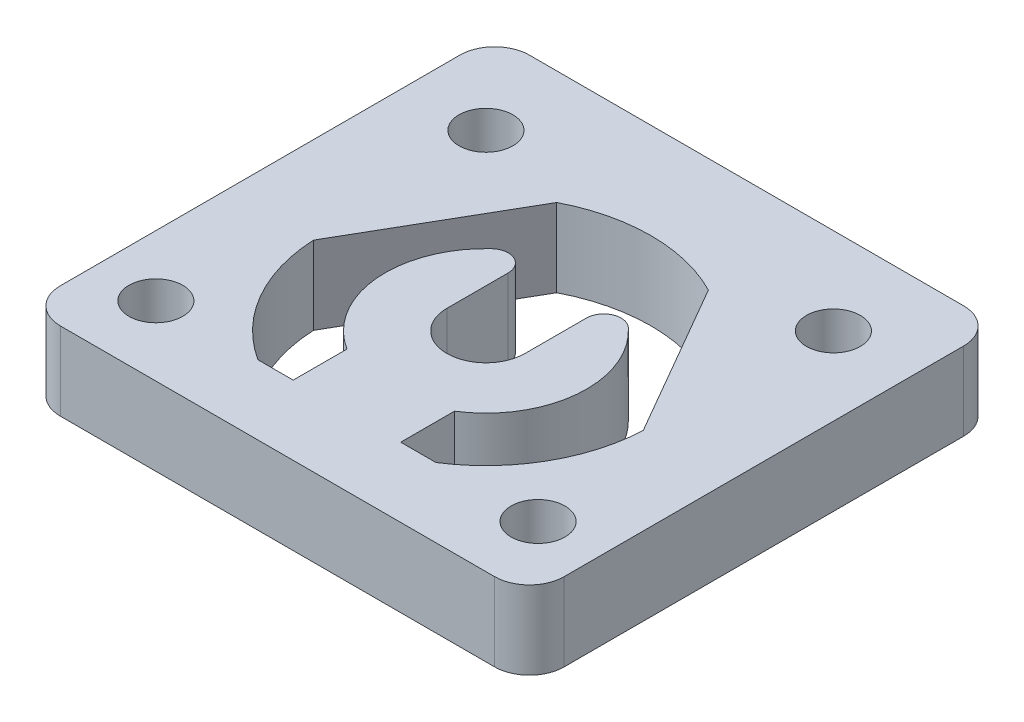
ISO-10303-21;
HEADER;
FILE_DESCRIPTION(('STEP AP214'),'2;1');
FILE_NAME('part.step','',(''),(''),'','','');
FILE_SCHEMA(('AUTOMOTIVE_DESIGN { 1 0 10303 214 1 1 1 1 }'));
ENDSEC;
DATA;
#1=APPLICATION_CONTEXT('core data for automotive mechanical design processes');
#2=APPLICATION_PROTOCOL_DEFINITION('international standard','automotive_design',2000,#1);
#3=PRODUCT_CONTEXT('',#1,'mechanical');
#4=PRODUCT('Part','Part','',(#3));
#5=PRODUCT_RELATED_PRODUCT_CATEGORY('part','',(#4));
#6=PRODUCT_DEFINITION_FORMATION('','',#4);
#7=PRODUCT_DEFINITION_CONTEXT('part definition',#1,'design');
#8=PRODUCT_DEFINITION('design','',#6,#7);
#9=PRODUCT_DEFINITION_SHAPE('','',#8);
#10=(LENGTH_UNIT() NAMED_UNIT(*) SI_UNIT(.MILLI.,.METRE.));
#11=(NAMED_UNIT(*) PLANE_ANGLE_UNIT() SI_UNIT($,.RADIAN.));
#12=(NAMED_UNIT(*) SI_UNIT($,.STERADIAN.) SOLID_ANGLE_UNIT());
#13=UNCERTAINTY_MEASURE_WITH_UNIT(LENGTH_MEASURE(1.E-05),#10,'distance_accuracy_value','');
#14=(GEOMETRIC_REPRESENTATION_CONTEXT(3) GLOBAL_UNCERTAINTY_ASSIGNED_CONTEXT((#13)) GLOBAL_UNIT_ASSIGNED_CONTEXT((#10,
#11,#12)) REPRESENTATION_CONTEXT('',''));
#15=CARTESIAN_POINT('',(0.,0.,0.));
#16=DIRECTION('',(0.,0.,1.));
#17=DIRECTION('',(1.,0.,0.));
#18=AXIS2_PLACEMENT_3D('',#15,#16,#17);
#19=CARTESIAN_POINT('',(12.5,4.5,-13.));
#20=DIRECTION('',(0.,-1.,0.));
#21=DIRECTION('',(0.,0.,-1.));
#22=AXIS2_PLACEMENT_3D('',#19,#20,#21);
#23=PLANE('',#22);
#24=CARTESIAN_POINT('',(12.5,4.5,-13.));
#25=DIRECTION('',(0.,1.,0.));
#26=DIRECTION('',(0.,0.,-1.));
#27=AXIS2_PLACEMENT_3D('',#24,#25,#26);
#28=CIRCLE('',#27,2.);
#29=CARTESIAN_POINT('',(14.5,4.5,-13.));
#30=VERTEX_POINT('',#29);
#31=CARTESIAN_POINT('',(12.5,4.5,-15.));
#32=VERTEX_POINT('',#31);
#33=EDGE_CURVE('E324',#30,#32,#28,.T.);
#34=ORIENTED_EDGE('',*,*,#33,.T.);
#35=DIRECTION('',(-1.,0.,0.));
#36=VECTOR('',#35,1.);
#37=CARTESIAN_POINT('',(-12.5,4.5,-15.));
#38=LINE('',#37,#36);
#39=CARTESIAN_POINT('',(-12.5,4.5,-15.));
#40=VERTEX_POINT('',#39);
#41=EDGE_CURVE('E327',#32,#40,#38,.T.);
#42=ORIENTED_EDGE('',*,*,#41,.T.);
#43=CARTESIAN_POINT('',(-12.5,4.5,-13.));
#44=DIRECTION('',(0.,1.,0.));
#45=DIRECTION('',(0.,0.,-1.));
#46=AXIS2_PLACEMENT_3D('',#43,#44,#45);
#47=CIRCLE('',#46,2.);
#48=CARTESIAN_POINT('',(-14.5,4.5,-13.));
#49=VERTEX_POINT('',#48);
#50=EDGE_CURVE('E330',#40,#49,#47,.T.);
#51=ORIENTED_EDGE('',*,*,#50,.T.);
#52=DIRECTION('',(0.,0.,1.));
#53=VECTOR('',#52,1.);
#54=CARTESIAN_POINT('',(-14.5,4.5,9.99999999999998));
#55=LINE('',#54,#53);
#56=CARTESIAN_POINT('',(-14.5,4.5,9.99999999999998));
#57=VERTEX_POINT('',#56);
#58=EDGE_CURVE('E332',#49,#57,#55,.T.);
#59=ORIENTED_EDGE('',*,*,#58,.T.);
#60=CARTESIAN_POINT('',(-12.5,4.5,9.99999999999999));
#61=DIRECTION('',(0.,1.,0.));
#62=DIRECTION('',(0.,0.,1.));
#63=AXIS2_PLACEMENT_3D('',#60,#61,#62);
#64=CIRCLE('',#63,2.);
#65=CARTESIAN_POINT('',(-12.5,4.5,12.));
#66=VERTEX_POINT('',#65);
#67=EDGE_CURVE('E334',#57,#66,#64,.T.);
#68=ORIENTED_EDGE('',*,*,#67,.T.);
#69=DIRECTION('',(1.,0.,0.));
#70=VECTOR('',#69,1.);
#71=CARTESIAN_POINT('',(-12.5,4.5,12.));
#72=LINE('',#71,#70);
#73=CARTESIAN_POINT('',(12.5,4.5,12.));
#74=VERTEX_POINT('',#73);
#75=EDGE_CURVE('E336',#66,#74,#72,.T.);
#76=ORIENTED_EDGE('',*,*,#75,.T.);
#77=CARTESIAN_POINT('',(12.5,4.5,10.));
#78=DIRECTION('',(0.,1.,0.));
#79=DIRECTION('',(0.,0.,1.));
#80=AXIS2_PLACEMENT_3D('',#77,#78,#79);
#81=CIRCLE('',#80,2.);
#82=CARTESIAN_POINT('',(14.5,4.5,9.99999999999998));
#83=VERTEX_POINT('',#82);
#84=EDGE_CURVE('E338',#74,#83,#81,.T.);
#85=ORIENTED_EDGE('',*,*,#84,.T.);
#86=DIRECTION('',(0.,0.,-1.));
#87=VECTOR('',#86,1.);
#88=CARTESIAN_POINT('',(14.5,4.5,9.99999999999998));
#89=LINE('',#88,#87);
#90=EDGE_CURVE('E340',#83,#30,#89,.T.);
#91=ORIENTED_EDGE('',*,*,#90,.T.);
#92=EDGE_LOOP('',(#34,#42,#51,#59,#68,#76,#85,#91));
#93=FACE_BOUND('',#92,.T.);
#94=CARTESIAN_POINT('',(0.,4.5,0.));
#95=DIRECTION('',(0.,-1.,0.));
#96=DIRECTION('',(0.,0.,1.));
#97=AXIS2_PLACEMENT_3D('',#94,#95,#96);
#98=CIRCLE('',#97,5.8);
#99=CARTESIAN_POINT('',(3.92708333333333,4.5,-4.26825684478518));
#100=VERTEX_POINT('',#99);
#101=CARTESIAN_POINT('',(3.09475362508875,4.5,4.90535421758715));
#102=VERTEX_POINT('',#101);
#103=EDGE_CURVE('E200',#100,#102,#98,.T.);
#104=ORIENTED_EDGE('',*,*,#103,.F.);
#105=CARTESIAN_POINT('',(3.25,4.5,-3.53235049223601));
#106=DIRECTION('',(0.,-1.,0.));
#107=DIRECTION('',(0.,0.,-1.));
#108=AXIS2_PLACEMENT_3D('',#105,#106,#107);
#109=CIRCLE('',#108,1.);
#110=CARTESIAN_POINT('',(2.25,4.5,-3.53235049223601));
#111=VERTEX_POINT('',#110);
#112=EDGE_CURVE('E251',#111,#100,#109,.T.);
#113=ORIENTED_EDGE('',*,*,#112,.F.);
#114=DIRECTION('',(0.,0.,-1.));
#115=VECTOR('',#114,1.);
#116=CARTESIAN_POINT('',(2.25,4.5,-3.53235049223601));
#117=LINE('',#116,#115);
#118=CARTESIAN_POINT('',(2.25,4.5,0.));
#119=VERTEX_POINT('',#118);
#120=EDGE_CURVE('E249',#119,#111,#117,.T.);
#121=ORIENTED_EDGE('',*,*,#120,.F.);
#122=CARTESIAN_POINT('',(0.,4.5,0.));
#123=DIRECTION('',(0.,1.,0.));
#124=DIRECTION('',(0.,0.,1.));
#125=AXIS2_PLACEMENT_3D('',#122,#123,#124);
#126=CIRCLE('',#125,2.25);
#127=CARTESIAN_POINT('',(-2.25,4.5,0.));
#128=VERTEX_POINT('',#127);
#129=EDGE_CURVE('E247',#128,#119,#126,.T.);
#130=ORIENTED_EDGE('',*,*,#129,.F.);
#131=DIRECTION('',(0.,0.,1.));
#132=VECTOR('',#131,1.);
#133=CARTESIAN_POINT('',(-2.25,4.5,-3.53235049223601));
#134=LINE('',#133,#132);
#135=CARTESIAN_POINT('',(-2.25,4.5,-3.53235049223601));
#136=VERTEX_POINT('',#135);
#137=EDGE_CURVE('E245',#136,#128,#134,.T.);
#138=ORIENTED_EDGE('',*,*,#137,.F.);
#139=CARTESIAN_POINT('',(-3.25,4.5,-3.53235049223601));
#140=DIRECTION('',(0.,-1.,0.));
#141=DIRECTION('',(0.,0.,1.));
#142=AXIS2_PLACEMENT_3D('',#139,#140,#141);
#143=CIRCLE('',#142,1.);
#144=CARTESIAN_POINT('',(-3.92708333333333,4.5,-4.26825684478518));
#145=VERTEX_POINT('',#144);
#146=EDGE_CURVE('E243',#145,#136,#143,.T.);
#147=ORIENTED_EDGE('',*,*,#146,.F.);
#148=CARTESIAN_POINT('',(0.,4.5,0.));
#149=DIRECTION('',(0.,-1.,0.));
#150=DIRECTION('',(0.,0.,1.));
#151=AXIS2_PLACEMENT_3D('',#148,#149,#150);
#152=CIRCLE('',#151,5.8);
#153=CARTESIAN_POINT('',(-3.09475362508875,4.5,4.90535421758715));
#154=VERTEX_POINT('',#153);
#155=EDGE_CURVE('E241',#154,#145,#152,.T.);
#156=ORIENTED_EDGE('',*,*,#155,.F.);
#157=DIRECTION('',(0.,0.,-1.));
#158=VECTOR('',#157,1.);
#159=CARTESIAN_POINT('',(-3.09475362508875,4.5,4.90535421758715));
#160=LINE('',#159,#158);
#161=CARTESIAN_POINT('',(-3.09475362508875,4.5,8.));
#162=VERTEX_POINT('',#161);
#163=EDGE_CURVE('E239',#162,#154,#160,.T.);
#164=ORIENTED_EDGE('',*,*,#163,.F.);
#165=DIRECTION('',(1.,0.,0.));
#166=VECTOR('',#165,1.);
#167=CARTESIAN_POINT('',(-5.1234753829798,4.5,8.));
#168=LINE('',#167,#166);
#169=CARTESIAN_POINT('',(-5.1234753829798,4.5,8.));
#170=VERTEX_POINT('',#169);
#171=EDGE_CURVE('E237',#170,#162,#168,.T.);
#172=ORIENTED_EDGE('',*,*,#171,.F.);
#173=CARTESIAN_POINT('',(0.,4.5,0.));
#174=DIRECTION('',(0.,1.,0.));
#175=DIRECTION('',(0.,0.,1.));
#176=AXIS2_PLACEMENT_3D('',#173,#174,#175);
#177=CIRCLE('',#176,9.5);
#178=CARTESIAN_POINT('',(-9.48994092176541,4.5,0.437059837324667));
#179=VERTEX_POINT('',#178);
#180=EDGE_CURVE('E235',#179,#170,#177,.T.);
#181=ORIENTED_EDGE('',*,*,#180,.F.);
#182=DIRECTION('',(-0.500000000000005,0.,0.866025403784436));
#183=VECTOR('',#182,1.);
#184=CARTESIAN_POINT('',(-4.36646553878556,4.5,-8.43705983732473));
#185=LINE('',#184,#183);
#186=CARTESIAN_POINT('',(-4.36646553878557,4.5,-8.43705983732473));
#187=VERTEX_POINT('',#186);
#188=EDGE_CURVE('E233',#187,#179,#185,.T.);
#189=ORIENTED_EDGE('',*,*,#188,.F.);
#190=CARTESIAN_POINT('',(0.,4.5,0.));
#191=DIRECTION('',(0.,1.,0.));
#192=DIRECTION('',(0.,0.,1.));
#193=AXIS2_PLACEMENT_3D('',#190,#191,#192);
#194=CIRCLE('',#193,9.5);
#195=CARTESIAN_POINT('',(4.36646553878556,4.5,-8.43705983732473));
#196=VERTEX_POINT('',#195);
#197=EDGE_CURVE('E231',#196,#187,#194,.T.);
#198=ORIENTED_EDGE('',*,*,#197,.F.);
#199=DIRECTION('',(-0.500000000000004,0.,-0.866025403784436));
#200=VECTOR('',#199,1.);
#201=CARTESIAN_POINT('',(4.36646553878556,4.5,-8.43705983732473));
#202=LINE('',#201,#200);
#203=CARTESIAN_POINT('',(9.48994092176541,4.5,0.437059837324668));
#204=VERTEX_POINT('',#203);
#205=EDGE_CURVE('E229',#204,#196,#202,.T.);
#206=ORIENTED_EDGE('',*,*,#205,.F.);
#207=CARTESIAN_POINT('',(0.,4.5,0.));
#208=DIRECTION('',(0.,1.,0.));
#209=DIRECTION('',(0.,0.,-1.));
#210=AXIS2_PLACEMENT_3D('',#207,#208,#209);
#211=CIRCLE('',#210,9.5);
#212=CARTESIAN_POINT('',(5.1234753829798,4.5,8.));
#213=VERTEX_POINT('',#212);
#214=EDGE_CURVE('E224',#213,#204,#211,.T.);
#215=ORIENTED_EDGE('',*,*,#214,.F.);
#216=DIRECTION('',(1.,0.,0.));
#217=VECTOR('',#216,1.);
#218=CARTESIAN_POINT('',(5.1234753829798,4.5,8.));
#219=LINE('',#218,#217);
#220=CARTESIAN_POINT('',(3.09475362508875,4.5,8.));
#221=VERTEX_POINT('',#220);
#222=EDGE_CURVE('E222',#221,#213,#219,.T.);
#223=ORIENTED_EDGE('',*,*,#222,.F.);
#224=DIRECTION('',(0.,0.,1.));
#225=VECTOR('',#224,1.);
#226=CARTESIAN_POINT('',(3.09475362508875,4.5,4.90535421758715));
#227=LINE('',#226,#225);
#228=EDGE_CURVE('E208',#102,#221,#227,.T.);
#229=ORIENTED_EDGE('',*,*,#228,.F.);
#230=EDGE_LOOP('',(#104,#113,#121,#130,#138,#147,#156,#164,#172,#181,#189,#198,#206,#215,#223,#229));
#231=FACE_BOUND('',#230,.T.);
#232=CARTESIAN_POINT('',(10.,4.5,-10.));
#233=DIRECTION('',(0.,1.,0.));
#234=DIRECTION('',(0.,0.,1.));
#235=AXIS2_PLACEMENT_3D('',#232,#233,#234);
#236=CIRCLE('',#235,1.55);
#237=CARTESIAN_POINT('',(10.,4.5,-8.45));
#238=VERTEX_POINT('',#237);
#239=EDGE_CURVE('E254',#238,#238,#236,.T.);
#240=ORIENTED_EDGE('',*,*,#239,.F.);
#241=EDGE_LOOP('',(#240));
#242=FACE_BOUND('',#241,.T.);
#243=CARTESIAN_POINT('',(11.,4.5,8.));
#244=DIRECTION('',(0.,1.,0.));
#245=DIRECTION('',(0.,0.,1.));
#246=AXIS2_PLACEMENT_3D('',#243,#244,#245);
#247=CIRCLE('',#246,1.55);
#248=CARTESIAN_POINT('',(11.,4.5,9.55));
#249=VERTEX_POINT('',#248);
#250=EDGE_CURVE('E534',#249,#249,#247,.T.);
#251=ORIENTED_EDGE('',*,*,#250,.F.);
#252=EDGE_LOOP('',(#251));
#253=FACE_BOUND('',#252,.T.);
#254=CARTESIAN_POINT('',(-11.,4.5,7.99999999999999));
#255=DIRECTION('',(0.,1.,0.));
#256=DIRECTION('',(0.,0.,-1.));
#257=AXIS2_PLACEMENT_3D('',#254,#255,#256);
#258=CIRCLE('',#257,1.55);
#259=CARTESIAN_POINT('',(-11.,4.5,6.44999999999999));
#260=VERTEX_POINT('',#259);
#261=EDGE_CURVE('E528',#260,#260,#258,.T.);
#262=ORIENTED_EDGE('',*,*,#261,.F.);
#263=EDGE_LOOP('',(#262));
#264=FACE_BOUND('',#263,.T.);
#265=CARTESIAN_POINT('',(-10.,4.5,-9.99999999999999));
#266=DIRECTION('',(0.,1.,0.));
#267=DIRECTION('',(0.,0.,-1.));
#268=AXIS2_PLACEMENT_3D('',#265,#266,#267);
#269=CIRCLE('',#268,1.55);
#270=CARTESIAN_POINT('',(-10.,4.5,-11.55));
#271=VERTEX_POINT('',#270);
#272=EDGE_CURVE('E519',#271,#271,#269,.T.);
#273=ORIENTED_EDGE('',*,*,#272,.F.);
#274=EDGE_LOOP('',(#273));
#275=FACE_BOUND('',#274,.T.);
#276=ADVANCED_FACE('F39',(#93,#231,#242,#253,#264,#275),#23,.F.);
#277=CARTESIAN_POINT('',(12.5,0.,-13.));
#278=DIRECTION('',(0.,-1.,0.));
#279=DIRECTION('',(0.,0.,-1.));
#280=AXIS2_PLACEMENT_3D('',#277,#278,#279);
#281=PLANE('',#280);
#282=CARTESIAN_POINT('',(-11.,0.,7.99999999999999));
#283=DIRECTION('',(0.,1.,0.));
#284=DIRECTION('',(0.,0.,-1.));
#285=AXIS2_PLACEMENT_3D('',#282,#283,#284);
#286=CIRCLE('',#285,1.55);
#287=CARTESIAN_POINT('',(-11.,0.,6.44999999999999));
#288=VERTEX_POINT('',#287);
#289=EDGE_CURVE('E525',#288,#288,#286,.T.);
#290=ORIENTED_EDGE('',*,*,#289,.T.);
#291=EDGE_LOOP('',(#290));
#292=FACE_BOUND('',#291,.T.);
#293=CARTESIAN_POINT('',(10.,0.,-10.));
#294=DIRECTION('',(0.,1.,0.));
#295=DIRECTION('',(0.,0.,1.));
#296=AXIS2_PLACEMENT_3D('',#293,#294,#295);
#297=CIRCLE('',#296,1.55);
#298=CARTESIAN_POINT('',(10.,0.,-8.45));
#299=VERTEX_POINT('',#298);
#300=EDGE_CURVE('E537',#299,#299,#297,.T.);
#301=ORIENTED_EDGE('',*,*,#300,.T.);
#302=EDGE_LOOP('',(#301));
#303=FACE_BOUND('',#302,.T.);
#304=CARTESIAN_POINT('',(12.5,0.,-13.));
#305=DIRECTION('',(0.,1.,0.));
#306=DIRECTION('',(0.,0.,-1.));
#307=AXIS2_PLACEMENT_3D('',#304,#305,#306);
#308=CIRCLE('',#307,2.);
#309=CARTESIAN_POINT('',(14.5,0.,-13.));
#310=VERTEX_POINT('',#309);
#311=CARTESIAN_POINT('',(12.5,0.,-15.));
#312=VERTEX_POINT('',#311);
#313=EDGE_CURVE('E216',#310,#312,#308,.T.);
#314=ORIENTED_EDGE('',*,*,#313,.F.);
#315=DIRECTION('',(0.,0.,-1.));
#316=VECTOR('',#315,1.);
#317=CARTESIAN_POINT('',(14.5,0.,9.99999999999998));
#318=LINE('',#317,#316);
#319=CARTESIAN_POINT('',(14.5,0.,9.99999999999998));
#320=VERTEX_POINT('',#319);
#321=EDGE_CURVE('E328',#320,#310,#318,.T.);
#322=ORIENTED_EDGE('',*,*,#321,.F.);
#323=CARTESIAN_POINT('',(12.5,0.,10.));
#324=DIRECTION('',(0.,1.,0.));
#325=DIRECTION('',(0.,0.,1.));
#326=AXIS2_PLACEMENT_3D('',#323,#324,#325);
#327=CIRCLE('',#326,2.);
#328=CARTESIAN_POINT('',(12.5,0.,12.));
#329=VERTEX_POINT('',#328);
#330=EDGE_CURVE('E355',#329,#320,#327,.T.);
#331=ORIENTED_EDGE('',*,*,#330,.F.);
#332=DIRECTION('',(1.,0.,0.));
#333=VECTOR('',#332,1.);
#334=CARTESIAN_POINT('',(-12.5,0.,12.));
#335=LINE('',#334,#333);
#336=CARTESIAN_POINT('',(-12.5,0.,12.));
#337=VERTEX_POINT('',#336);
#338=EDGE_CURVE('E353',#337,#329,#335,.T.);
#339=ORIENTED_EDGE('',*,*,#338,.F.);
#340=CARTESIAN_POINT('',(-12.5,0.,9.99999999999999));
#341=DIRECTION('',(0.,1.,0.));
#342=DIRECTION('',(0.,0.,1.));
#343=AXIS2_PLACEMENT_3D('',#340,#341,#342);
#344=CIRCLE('',#343,2.);
#345=CARTESIAN_POINT('',(-14.5,0.,9.99999999999998));
#346=VERTEX_POINT('',#345);
#347=EDGE_CURVE('E351',#346,#337,#344,.T.);
#348=ORIENTED_EDGE('',*,*,#347,.F.);
#349=DIRECTION('',(0.,0.,1.));
#350=VECTOR('',#349,1.);
#351=CARTESIAN_POINT('',(-14.5,0.,9.99999999999998));
#352=LINE('',#351,#350);
#353=CARTESIAN_POINT('',(-14.5,0.,-13.));
#354=VERTEX_POINT('',#353);
#355=EDGE_CURVE('E349',#354,#346,#352,.T.);
#356=ORIENTED_EDGE('',*,*,#355,.F.);
#357=CARTESIAN_POINT('',(-12.5,0.,-13.));
#358=DIRECTION('',(0.,1.,0.));
#359=DIRECTION('',(0.,0.,-1.));
#360=AXIS2_PLACEMENT_3D('',#357,#358,#359);
#361=CIRCLE('',#360,2.);
#362=CARTESIAN_POINT('',(-12.5,0.,-15.));
#363=VERTEX_POINT('',#362);
#364=EDGE_CURVE('E347',#363,#354,#361,.T.);
#365=ORIENTED_EDGE('',*,*,#364,.F.);
#366=DIRECTION('',(-1.,0.,0.));
#367=VECTOR('',#366,1.);
#368=CARTESIAN_POINT('',(-12.5,0.,-15.));
#369=LINE('',#368,#367);
#370=EDGE_CURVE('E345',#312,#363,#369,.T.);
#371=ORIENTED_EDGE('',*,*,#370,.F.);
#372=EDGE_LOOP('',(#314,#322,#331,#339,#348,#356,#365,#371));
#373=FACE_BOUND('',#372,.T.);
#374=CARTESIAN_POINT('',(3.25,0.,-3.53235049223601));
#375=DIRECTION('',(0.,-1.,0.));
#376=DIRECTION('',(0.,0.,-1.));
#377=AXIS2_PLACEMENT_3D('',#374,#375,#376);
#378=CIRCLE('',#377,1.);
#379=CARTESIAN_POINT('',(2.25,0.,-3.53235049223601));
#380=VERTEX_POINT('',#379);
#381=CARTESIAN_POINT('',(3.92708333333333,0.,-4.26825684478518));
#382=VERTEX_POINT('',#381);
#383=EDGE_CURVE('E209',#380,#382,#378,.T.);
#384=ORIENTED_EDGE('',*,*,#383,.T.);
#385=CARTESIAN_POINT('',(0.,0.,0.));
#386=DIRECTION('',(0.,-1.,0.));
#387=DIRECTION('',(0.,0.,1.));
#388=AXIS2_PLACEMENT_3D('',#385,#386,#387);
#389=CIRCLE('',#388,5.8);
#390=CARTESIAN_POINT('',(3.09475362508875,0.,4.90535421758715));
#391=VERTEX_POINT('',#390);
#392=EDGE_CURVE('E62',#382,#391,#389,.T.);
#393=ORIENTED_EDGE('',*,*,#392,.T.);
#394=DIRECTION('',(0.,0.,1.));
#395=VECTOR('',#394,1.);
#396=CARTESIAN_POINT('',(3.09475362508875,0.,4.90535421758715));
#397=LINE('',#396,#395);
#398=CARTESIAN_POINT('',(3.09475362508875,0.,8.));
#399=VERTEX_POINT('',#398);
#400=EDGE_CURVE('E215',#391,#399,#397,.T.);
#401=ORIENTED_EDGE('',*,*,#400,.T.);
#402=DIRECTION('',(1.,0.,0.));
#403=VECTOR('',#402,1.);
#404=CARTESIAN_POINT('',(5.1234753829798,0.,8.));
#405=LINE('',#404,#403);
#406=CARTESIAN_POINT('',(5.1234753829798,0.,8.));
#407=VERTEX_POINT('',#406);
#408=EDGE_CURVE('E256',#399,#407,#405,.T.);
#409=ORIENTED_EDGE('',*,*,#408,.T.);
#410=CARTESIAN_POINT('',(0.,0.,0.));
#411=DIRECTION('',(0.,1.,0.));
#412=DIRECTION('',(0.,0.,-1.));
#413=AXIS2_PLACEMENT_3D('',#410,#411,#412);
#414=CIRCLE('',#413,9.5);
#415=CARTESIAN_POINT('',(9.48994092176541,0.,0.437059837324668));
#416=VERTEX_POINT('',#415);
#417=EDGE_CURVE('E259',#407,#416,#414,.T.);
#418=ORIENTED_EDGE('',*,*,#417,.T.);
#419=DIRECTION('',(-0.500000000000004,0.,-0.866025403784436));
#420=VECTOR('',#419,1.);
#421=CARTESIAN_POINT('',(4.36646553878556,0.,-8.43705983732473));
#422=LINE('',#421,#420);
#423=CARTESIAN_POINT('',(4.36646553878556,0.,-8.43705983732473));
#424=VERTEX_POINT('',#423);
#425=EDGE_CURVE('E262',#416,#424,#422,.T.);
#426=ORIENTED_EDGE('',*,*,#425,.T.);
#427=CARTESIAN_POINT('',(0.,0.,0.));
#428=DIRECTION('',(0.,1.,0.));
#429=DIRECTION('',(0.,0.,1.));
#430=AXIS2_PLACEMENT_3D('',#427,#428,#429);
#431=CIRCLE('',#430,9.5);
#432=CARTESIAN_POINT('',(-4.36646553878557,0.,-8.43705983732473));
#433=VERTEX_POINT('',#432);
#434=EDGE_CURVE('E265',#424,#433,#431,.T.);
#435=ORIENTED_EDGE('',*,*,#434,.T.);
#436=DIRECTION('',(-0.500000000000005,0.,0.866025403784436));
#437=VECTOR('',#436,1.);
#438=CARTESIAN_POINT('',(-4.36646553878556,0.,-8.43705983732473));
#439=LINE('',#438,#437);
#440=CARTESIAN_POINT('',(-9.48994092176541,0.,0.437059837324667));
#441=VERTEX_POINT('',#440);
#442=EDGE_CURVE('E268',#433,#441,#439,.T.);
#443=ORIENTED_EDGE('',*,*,#442,.T.);
#444=CARTESIAN_POINT('',(0.,0.,0.));
#445=DIRECTION('',(0.,1.,0.));
#446=DIRECTION('',(0.,0.,1.));
#447=AXIS2_PLACEMENT_3D('',#444,#445,#446);
#448=CIRCLE('',#447,9.5);
#449=CARTESIAN_POINT('',(-5.1234753829798,0.,8.));
#450=VERTEX_POINT('',#449);
#451=EDGE_CURVE('E271',#441,#450,#448,.T.);
#452=ORIENTED_EDGE('',*,*,#451,.T.);
#453=DIRECTION('',(1.,0.,0.));
#454=VECTOR('',#453,1.);
#455=CARTESIAN_POINT('',(-5.1234753829798,0.,8.));
#456=LINE('',#455,#454);
#457=CARTESIAN_POINT('',(-3.09475362508875,0.,8.));
#458=VERTEX_POINT('',#457);
#459=EDGE_CURVE('E274',#450,#458,#456,.T.);
#460=ORIENTED_EDGE('',*,*,#459,.T.);
#461=DIRECTION('',(0.,0.,-1.));
#462=VECTOR('',#461,1.);
#463=CARTESIAN_POINT('',(-3.09475362508875,0.,4.90535421758715));
#464=LINE('',#463,#462);
#465=CARTESIAN_POINT('',(-3.09475362508875,0.,4.90535421758715));
#466=VERTEX_POINT('',#465);
#467=EDGE_CURVE('E277',#458,#466,#464,.T.);
#468=ORIENTED_EDGE('',*,*,#467,.T.);
#469=CARTESIAN_POINT('',(0.,0.,0.));
#470=DIRECTION('',(0.,-1.,0.));
#471=DIRECTION('',(0.,0.,1.));
#472=AXIS2_PLACEMENT_3D('',#469,#470,#471);
#473=CIRCLE('',#472,5.8);
#474=CARTESIAN_POINT('',(-3.92708333333333,0.,-4.26825684478518));
#475=VERTEX_POINT('',#474);
#476=EDGE_CURVE('E280',#466,#475,#473,.T.);
#477=ORIENTED_EDGE('',*,*,#476,.T.);
#478=CARTESIAN_POINT('',(-3.25,0.,-3.53235049223601));
#479=DIRECTION('',(0.,-1.,0.));
#480=DIRECTION('',(0.,0.,1.));
#481=AXIS2_PLACEMENT_3D('',#478,#479,#480);
#482=CIRCLE('',#481,1.);
#483=CARTESIAN_POINT('',(-2.25,0.,-3.53235049223601));
#484=VERTEX_POINT('',#483);
#485=EDGE_CURVE('E283',#475,#484,#482,.T.);
#486=ORIENTED_EDGE('',*,*,#485,.T.);
#487=DIRECTION('',(0.,0.,1.));
#488=VECTOR('',#487,1.);
#489=CARTESIAN_POINT('',(-2.25,0.,-3.53235049223601));
#490=LINE('',#489,#488);
#491=CARTESIAN_POINT('',(-2.25,0.,0.));
#492=VERTEX_POINT('',#491);
#493=EDGE_CURVE('E286',#484,#492,#490,.T.);
#494=ORIENTED_EDGE('',*,*,#493,.T.);
#495=CARTESIAN_POINT('',(0.,0.,0.));
#496=DIRECTION('',(0.,1.,0.));
#497=DIRECTION('',(0.,0.,1.));
#498=AXIS2_PLACEMENT_3D('',#495,#496,#497);
#499=CIRCLE('',#498,2.25);
#500=CARTESIAN_POINT('',(2.25,0.,0.));
#501=VERTEX_POINT('',#500);
#502=EDGE_CURVE('E289',#492,#501,#499,.T.);
#503=ORIENTED_EDGE('',*,*,#502,.T.);
#504=DIRECTION('',(0.,0.,-1.));
#505=VECTOR('',#504,1.);
#506=CARTESIAN_POINT('',(2.25,0.,-3.53235049223601));
#507=LINE('',#506,#505);
#508=EDGE_CURVE('E292',#501,#380,#507,.T.);
#509=ORIENTED_EDGE('',*,*,#508,.T.);
#510=EDGE_LOOP('',(#384,#393,#401,#409,#418,#426,#435,#443,#452,#460,#468,#477,#486,#494,#503,#509));
#511=FACE_BOUND('',#510,.T.);
#512=CARTESIAN_POINT('',(11.,0.,8.));
#513=DIRECTION('',(0.,1.,0.));
#514=DIRECTION('',(0.,0.,1.));
#515=AXIS2_PLACEMENT_3D('',#512,#513,#514);
#516=CIRCLE('',#515,1.55);
#517=CARTESIAN_POINT('',(11.,0.,9.55));
#518=VERTEX_POINT('',#517);
#519=EDGE_CURVE('E531',#518,#518,#516,.T.);
#520=ORIENTED_EDGE('',*,*,#519,.T.);
#521=EDGE_LOOP('',(#520));
#522=FACE_BOUND('',#521,.T.);
#523=CARTESIAN_POINT('',(-10.,0.,-9.99999999999999));
#524=DIRECTION('',(0.,1.,0.));
#525=DIRECTION('',(0.,0.,-1.));
#526=AXIS2_PLACEMENT_3D('',#523,#524,#525);
#527=CIRCLE('',#526,1.55);
#528=CARTESIAN_POINT('',(-10.,0.,-11.55));
#529=VERTEX_POINT('',#528);
#530=EDGE_CURVE('E522',#529,#529,#527,.T.);
#531=ORIENTED_EDGE('',*,*,#530,.T.);
#532=EDGE_LOOP('',(#531));
#533=FACE_BOUND('',#532,.T.);
#534=ADVANCED_FACE('F385',(#292,#303,#373,#511,#522,#533),#281,.T.);
#535=CARTESIAN_POINT('',(12.5,4.5,-13.));
#536=DIRECTION('',(0.,-1.,0.));
#537=DIRECTION('',(0.,0.,-1.));
#538=AXIS2_PLACEMENT_3D('',#535,#536,#537);
#539=CYLINDRICAL_SURFACE('',#538,2.);
#540=ORIENTED_EDGE('',*,*,#313,.T.);
#541=DIRECTION('',(0.,-1.,0.));
#542=VECTOR('',#541,1.);
#543=CARTESIAN_POINT('',(12.5,4.5,-15.));
#544=LINE('',#543,#542);
#545=EDGE_CURVE('E11',#32,#312,#544,.T.);
#546=ORIENTED_EDGE('',*,*,#545,.F.);
#547=ORIENTED_EDGE('',*,*,#33,.F.);
#548=DIRECTION('',(0.,-1.,0.));
#549=VECTOR('',#548,1.);
#550=CARTESIAN_POINT('',(14.5,4.5,-13.));
#551=LINE('',#550,#549);
#552=EDGE_CURVE('E342',#30,#310,#551,.T.);
#553=ORIENTED_EDGE('',*,*,#552,.T.);
#554=EDGE_LOOP('',(#540,#546,#547,#553));
#555=FACE_BOUND('',#554,.T.);
#556=ADVANCED_FACE('F41',(#555),#539,.T.);
#557=CARTESIAN_POINT('',(-12.5,4.5,-15.));
#558=DIRECTION('',(0.,0.,1.));
#559=DIRECTION('',(1.,0.,0.));
#560=AXIS2_PLACEMENT_3D('',#557,#558,#559);
#561=PLANE('',#560);
#562=ORIENTED_EDGE('',*,*,#370,.T.);
#563=DIRECTION('',(0.,-1.,0.));
#564=VECTOR('',#563,1.);
#565=CARTESIAN_POINT('',(-12.5,4.5,-15.));
#566=LINE('',#565,#564);
#567=EDGE_CURVE('E47',#40,#363,#566,.T.);
#568=ORIENTED_EDGE('',*,*,#567,.F.);
#569=ORIENTED_EDGE('',*,*,#41,.F.);
#570=ORIENTED_EDGE('',*,*,#545,.T.);
#571=EDGE_LOOP('',(#562,#568,#569,#570));
#572=FACE_BOUND('',#571,.T.);
#573=ADVANCED_FACE('F402',(#572),#561,.F.);
#574=CARTESIAN_POINT('',(-12.5,4.5,-13.));
#575=DIRECTION('',(0.,-1.,0.));
#576=DIRECTION('',(0.,0.,-1.));
#577=AXIS2_PLACEMENT_3D('',#574,#575,#576);
#578=CYLINDRICAL_SURFACE('',#577,2.);
#579=ORIENTED_EDGE('',*,*,#364,.T.);
#580=DIRECTION('',(0.,-1.,0.));
#581=VECTOR('',#580,1.);
#582=CARTESIAN_POINT('',(-14.5,4.5,-13.));
#583=LINE('',#582,#581);
#584=EDGE_CURVE('E372',#49,#354,#583,.T.);
#585=ORIENTED_EDGE('',*,*,#584,.F.);
#586=ORIENTED_EDGE('',*,*,#50,.F.);
#587=ORIENTED_EDGE('',*,*,#567,.T.);
#588=EDGE_LOOP('',(#579,#585,#586,#587));
#589=FACE_BOUND('',#588,.T.);
#590=ADVANCED_FACE('F379',(#589),#578,.T.);
#591=CARTESIAN_POINT('',(-14.5,4.5,9.99999999999998));
#592=DIRECTION('',(1.,0.,0.));
#593=DIRECTION('',(0.,0.,-1.));
#594=AXIS2_PLACEMENT_3D('',#591,#592,#593);
#595=PLANE('',#594);
#596=ORIENTED_EDGE('',*,*,#355,.T.);
#597=DIRECTION('',(0.,-1.,0.));
#598=VECTOR('',#597,1.);
#599=CARTESIAN_POINT('',(-14.5,4.5,9.99999999999998));
#600=LINE('',#599,#598);
#601=EDGE_CURVE('E369',#57,#346,#600,.T.);
#602=ORIENTED_EDGE('',*,*,#601,.F.);
#603=ORIENTED_EDGE('',*,*,#58,.F.);
#604=ORIENTED_EDGE('',*,*,#584,.T.);
#605=EDGE_LOOP('',(#596,#602,#603,#604));
#606=FACE_BOUND('',#605,.T.);
#607=ADVANCED_FACE('F391',(#606),#595,.F.);
#608=CARTESIAN_POINT('',(-12.5,4.5,9.99999999999999));
#609=DIRECTION('',(0.,-1.,0.));
#610=DIRECTION('',(0.,0.,-1.));
#611=AXIS2_PLACEMENT_3D('',#608,#609,#610);
#612=CYLINDRICAL_SURFACE('',#611,2.);
#613=ORIENTED_EDGE('',*,*,#347,.T.);
#614=DIRECTION('',(0.,-1.,0.));
#615=VECTOR('',#614,1.);
#616=CARTESIAN_POINT('',(-12.5,4.5,12.));
#617=LINE('',#616,#615);
#618=EDGE_CURVE('E366',#66,#337,#617,.T.);
#619=ORIENTED_EDGE('',*,*,#618,.F.);
#620=ORIENTED_EDGE('',*,*,#67,.F.);
#621=ORIENTED_EDGE('',*,*,#601,.T.);
#622=EDGE_LOOP('',(#613,#619,#620,#621));
#623=FACE_BOUND('',#622,.T.);
#624=ADVANCED_FACE('F395',(#623),#612,.T.);
#625=CARTESIAN_POINT('',(-12.5,4.5,12.));
#626=DIRECTION('',(0.,0.,-1.));
#627=DIRECTION('',(-1.,0.,0.));
#628=AXIS2_PLACEMENT_3D('',#625,#626,#627);
#629=PLANE('',#628);
#630=ORIENTED_EDGE('',*,*,#338,.T.);
#631=DIRECTION('',(0.,-1.,0.));
#632=VECTOR('',#631,1.);
#633=CARTESIAN_POINT('',(12.5,4.5,12.));
#634=LINE('',#633,#632);
#635=EDGE_CURVE('E363',#74,#329,#634,.T.);
#636=ORIENTED_EDGE('',*,*,#635,.F.);
#637=ORIENTED_EDGE('',*,*,#75,.F.);
#638=ORIENTED_EDGE('',*,*,#618,.T.);
#639=EDGE_LOOP('',(#630,#636,#637,#638));
#640=FACE_BOUND('',#639,.T.);
#641=ADVANCED_FACE('F415',(#640),#629,.F.);
#642=CARTESIAN_POINT('',(12.5,4.5,10.));
#643=DIRECTION('',(0.,-1.,0.));
#644=DIRECTION('',(0.,0.,-1.));
#645=AXIS2_PLACEMENT_3D('',#642,#643,#644);
#646=CYLINDRICAL_SURFACE('',#645,2.);
#647=ORIENTED_EDGE('',*,*,#330,.T.);
#648=DIRECTION('',(0.,-1.,0.));
#649=VECTOR('',#648,1.);
#650=CARTESIAN_POINT('',(14.5,4.5,9.99999999999998));
#651=LINE('',#650,#649);
#652=EDGE_CURVE('E360',#83,#320,#651,.T.);
#653=ORIENTED_EDGE('',*,*,#652,.F.);
#654=ORIENTED_EDGE('',*,*,#84,.F.);
#655=ORIENTED_EDGE('',*,*,#635,.T.);
#656=EDGE_LOOP('',(#647,#653,#654,#655));
#657=FACE_BOUND('',#656,.T.);
#658=ADVANCED_FACE('F413',(#657),#646,.T.);
#659=CARTESIAN_POINT('',(14.5,4.5,9.99999999999998));
#660=DIRECTION('',(-1.,0.,0.));
#661=DIRECTION('',(0.,0.,1.));
#662=AXIS2_PLACEMENT_3D('',#659,#660,#661);
#663=PLANE('',#662);
#664=ORIENTED_EDGE('',*,*,#321,.T.);
#665=ORIENTED_EDGE('',*,*,#552,.F.);
#666=ORIENTED_EDGE('',*,*,#90,.F.);
#667=ORIENTED_EDGE('',*,*,#652,.T.);
#668=EDGE_LOOP('',(#664,#665,#666,#667));
#669=FACE_BOUND('',#668,.T.);
#670=ADVANCED_FACE('F408',(#669),#663,.F.);
#671=CARTESIAN_POINT('',(0.,4.5,0.));
#672=DIRECTION('',(0.,-1.,0.));
#673=DIRECTION('',(0.,0.,-1.));
#674=AXIS2_PLACEMENT_3D('',#671,#672,#673);
#675=CYLINDRICAL_SURFACE('',#674,5.8);
#676=ORIENTED_EDGE('',*,*,#392,.F.);
#677=DIRECTION('',(0.,-1.,0.));
#678=VECTOR('',#677,1.);
#679=CARTESIAN_POINT('',(3.92708333333333,4.5,-4.26825684478518));
#680=LINE('',#679,#678);
#681=EDGE_CURVE('E204',#100,#382,#680,.T.);
#682=ORIENTED_EDGE('',*,*,#681,.F.);
#683=ORIENTED_EDGE('',*,*,#103,.T.);
#684=DIRECTION('',(0.,-1.,0.));
#685=VECTOR('',#684,1.);
#686=CARTESIAN_POINT('',(3.09475362508875,4.5,4.90535421758715));
#687=LINE('',#686,#685);
#688=EDGE_CURVE('E203',#102,#391,#687,.T.);
#689=ORIENTED_EDGE('',*,*,#688,.T.);
#690=EDGE_LOOP('',(#676,#682,#683,#689));
#691=FACE_BOUND('',#690,.T.);
#692=ADVANCED_FACE('F202',(#691),#675,.T.);
#693=CARTESIAN_POINT('',(3.09475362508875,4.5,4.90535421758715));
#694=DIRECTION('',(1.,0.,0.));
#695=DIRECTION('',(0.,0.,-1.));
#696=AXIS2_PLACEMENT_3D('',#693,#694,#695);
#697=PLANE('',#696);
#698=ORIENTED_EDGE('',*,*,#400,.F.);
#699=ORIENTED_EDGE('',*,*,#688,.F.);
#700=ORIENTED_EDGE('',*,*,#228,.T.);
#701=DIRECTION('',(0.,-1.,0.));
#702=VECTOR('',#701,1.);
#703=CARTESIAN_POINT('',(3.09475362508875,4.5,8.));
#704=LINE('',#703,#702);
#705=EDGE_CURVE('E217',#221,#399,#704,.T.);
#706=ORIENTED_EDGE('',*,*,#705,.T.);
#707=EDGE_LOOP('',(#698,#699,#700,#706));
#708=FACE_BOUND('',#707,.T.);
#709=ADVANCED_FACE('F212',(#708),#697,.T.);
#710=CARTESIAN_POINT('',(5.1234753829798,4.5,8.));
#711=DIRECTION('',(0.,0.,-1.));
#712=DIRECTION('',(-1.,0.,0.));
#713=AXIS2_PLACEMENT_3D('',#710,#711,#712);
#714=PLANE('',#713);
#715=ORIENTED_EDGE('',*,*,#408,.F.);
#716=ORIENTED_EDGE('',*,*,#705,.F.);
#717=ORIENTED_EDGE('',*,*,#222,.T.);
#718=DIRECTION('',(0.,-1.,0.));
#719=VECTOR('',#718,1.);
#720=CARTESIAN_POINT('',(5.1234753829798,4.5,8.));
#721=LINE('',#720,#719);
#722=EDGE_CURVE('E321',#213,#407,#721,.T.);
#723=ORIENTED_EDGE('',*,*,#722,.T.);
#724=EDGE_LOOP('',(#715,#716,#717,#723));
#725=FACE_BOUND('',#724,.T.);
#726=ADVANCED_FACE('F441',(#725),#714,.T.);
#727=CARTESIAN_POINT('',(0.,4.5,0.));
#728=DIRECTION('',(0.,-1.,0.));
#729=DIRECTION('',(0.,0.,-1.));
#730=AXIS2_PLACEMENT_3D('',#727,#728,#729);
#731=CYLINDRICAL_SURFACE('',#730,9.5);
#732=ORIENTED_EDGE('',*,*,#417,.F.);
#733=ORIENTED_EDGE('',*,*,#722,.F.);
#734=ORIENTED_EDGE('',*,*,#214,.T.);
#735=DIRECTION('',(0.,-1.,0.));
#736=VECTOR('',#735,1.);
#737=CARTESIAN_POINT('',(9.48994092176541,4.5,0.437059837324668));
#738=LINE('',#737,#736);
#739=EDGE_CURVE('E319',#204,#416,#738,.T.);
#740=ORIENTED_EDGE('',*,*,#739,.T.);
#741=EDGE_LOOP('',(#732,#733,#734,#740));
#742=FACE_BOUND('',#741,.T.);
#743=ADVANCED_FACE('F445',(#742),#731,.F.);
#744=CARTESIAN_POINT('',(4.36646553878556,4.5,-8.43705983732473));
#745=DIRECTION('',(-0.866025403784436,0.,0.500000000000004));
#746=DIRECTION('',(0.500000000000005,0.,0.866025403784436));
#747=AXIS2_PLACEMENT_3D('',#744,#745,#746);
#748=PLANE('',#747);
#749=ORIENTED_EDGE('',*,*,#425,.F.);
#750=ORIENTED_EDGE('',*,*,#739,.F.);
#751=ORIENTED_EDGE('',*,*,#205,.T.);
#752=DIRECTION('',(0.,-1.,0.));
#753=VECTOR('',#752,1.);
#754=CARTESIAN_POINT('',(4.36646553878556,4.5,-8.43705983732473));
#755=LINE('',#754,#753);
#756=EDGE_CURVE('E317',#196,#424,#755,.T.);
#757=ORIENTED_EDGE('',*,*,#756,.T.);
#758=EDGE_LOOP('',(#749,#750,#751,#757));
#759=FACE_BOUND('',#758,.T.);
#760=ADVANCED_FACE('F451',(#759),#748,.T.);
#761=CARTESIAN_POINT('',(0.,4.5,0.));
#762=DIRECTION('',(0.,-1.,0.));
#763=DIRECTION('',(0.,0.,-1.));
#764=AXIS2_PLACEMENT_3D('',#761,#762,#763);
#765=CYLINDRICAL_SURFACE('',#764,9.5);
#766=ORIENTED_EDGE('',*,*,#434,.F.);
#767=ORIENTED_EDGE('',*,*,#756,.F.);
#768=ORIENTED_EDGE('',*,*,#197,.T.);
#769=DIRECTION('',(0.,-1.,0.));
#770=VECTOR('',#769,1.);
#771=CARTESIAN_POINT('',(-4.36646553878557,4.5,-8.43705983732473));
#772=LINE('',#771,#770);
#773=EDGE_CURVE('E315',#187,#433,#772,.T.);
#774=ORIENTED_EDGE('',*,*,#773,.T.);
#775=EDGE_LOOP('',(#766,#767,#768,#774));
#776=FACE_BOUND('',#775,.T.);
#777=ADVANCED_FACE('F455',(#776),#765,.F.);
#778=CARTESIAN_POINT('',(-4.36646553878556,4.5,-8.43705983732473));
#779=DIRECTION('',(0.866025403784436,0.,0.500000000000005));
#780=DIRECTION('',(0.500000000000005,0.,-0.866025403784436));
#781=AXIS2_PLACEMENT_3D('',#778,#779,#780);
#782=PLANE('',#781);
#783=ORIENTED_EDGE('',*,*,#442,.F.);
#784=ORIENTED_EDGE('',*,*,#773,.F.);
#785=ORIENTED_EDGE('',*,*,#188,.T.);
#786=DIRECTION('',(0.,-1.,0.));
#787=VECTOR('',#786,1.);
#788=CARTESIAN_POINT('',(-9.48994092176541,4.5,0.437059837324667));
#789=LINE('',#788,#787);
#790=EDGE_CURVE('E313',#179,#441,#789,.T.);
#791=ORIENTED_EDGE('',*,*,#790,.T.);
#792=EDGE_LOOP('',(#783,#784,#785,#791));
#793=FACE_BOUND('',#792,.T.);
#794=ADVANCED_FACE('F459',(#793),#782,.T.);
#795=CARTESIAN_POINT('',(0.,4.5,0.));
#796=DIRECTION('',(0.,-1.,0.));
#797=DIRECTION('',(0.,0.,-1.));
#798=AXIS2_PLACEMENT_3D('',#795,#796,#797);
#799=CYLINDRICAL_SURFACE('',#798,9.5);
#800=ORIENTED_EDGE('',*,*,#451,.F.);
#801=ORIENTED_EDGE('',*,*,#790,.F.);
#802=ORIENTED_EDGE('',*,*,#180,.T.);
#803=DIRECTION('',(0.,-1.,0.));
#804=VECTOR('',#803,1.);
#805=CARTESIAN_POINT('',(-5.1234753829798,4.5,8.));
#806=LINE('',#805,#804);
#807=EDGE_CURVE('E311',#170,#450,#806,.T.);
#808=ORIENTED_EDGE('',*,*,#807,.T.);
#809=EDGE_LOOP('',(#800,#801,#802,#808));
#810=FACE_BOUND('',#809,.T.);
#811=ADVANCED_FACE('F463',(#810),#799,.F.);
#812=CARTESIAN_POINT('',(-5.1234753829798,4.5,8.));
#813=DIRECTION('',(0.,0.,-1.));
#814=DIRECTION('',(-1.,0.,0.));
#815=AXIS2_PLACEMENT_3D('',#812,#813,#814);
#816=PLANE('',#815);
#817=ORIENTED_EDGE('',*,*,#459,.F.);
#818=ORIENTED_EDGE('',*,*,#807,.F.);
#819=ORIENTED_EDGE('',*,*,#171,.T.);
#820=DIRECTION('',(0.,-1.,0.));
#821=VECTOR('',#820,1.);
#822=CARTESIAN_POINT('',(-3.09475362508875,4.5,8.));
#823=LINE('',#822,#821);
#824=EDGE_CURVE('E309',#162,#458,#823,.T.);
#825=ORIENTED_EDGE('',*,*,#824,.T.);
#826=EDGE_LOOP('',(#817,#818,#819,#825));
#827=FACE_BOUND('',#826,.T.);
#828=ADVANCED_FACE('F467',(#827),#816,.T.);
#829=CARTESIAN_POINT('',(-3.09475362508875,4.5,4.90535421758715));
#830=DIRECTION('',(-1.,0.,0.));
#831=DIRECTION('',(0.,0.,1.));
#832=AXIS2_PLACEMENT_3D('',#829,#830,#831);
#833=PLANE('',#832);
#834=ORIENTED_EDGE('',*,*,#467,.F.);
#835=ORIENTED_EDGE('',*,*,#824,.F.);
#836=ORIENTED_EDGE('',*,*,#163,.T.);
#837=DIRECTION('',(0.,-1.,0.));
#838=VECTOR('',#837,1.);
#839=CARTESIAN_POINT('',(-3.09475362508875,4.5,4.90535421758715));
#840=LINE('',#839,#838);
#841=EDGE_CURVE('E307',#154,#466,#840,.T.);
#842=ORIENTED_EDGE('',*,*,#841,.T.);
#843=EDGE_LOOP('',(#834,#835,#836,#842));
#844=FACE_BOUND('',#843,.T.);
#845=ADVANCED_FACE('F471',(#844),#833,.T.);
#846=CARTESIAN_POINT('',(0.,4.5,0.));
#847=DIRECTION('',(0.,-1.,0.));
#848=DIRECTION('',(0.,0.,-1.));
#849=AXIS2_PLACEMENT_3D('',#846,#847,#848);
#850=CYLINDRICAL_SURFACE('',#849,5.8);
#851=ORIENTED_EDGE('',*,*,#476,.F.);
#852=ORIENTED_EDGE('',*,*,#841,.F.);
#853=ORIENTED_EDGE('',*,*,#155,.T.);
#854=DIRECTION('',(0.,-1.,0.));
#855=VECTOR('',#854,1.);
#856=CARTESIAN_POINT('',(-3.92708333333333,4.5,-4.26825684478518));
#857=LINE('',#856,#855);
#858=EDGE_CURVE('E305',#145,#475,#857,.T.);
#859=ORIENTED_EDGE('',*,*,#858,.T.);
#860=EDGE_LOOP('',(#851,#852,#853,#859));
#861=FACE_BOUND('',#860,.T.);
#862=ADVANCED_FACE('F475',(#861),#850,.T.);
#863=CARTESIAN_POINT('',(-3.25,4.5,-3.53235049223601));
#864=DIRECTION('',(0.,-1.,0.));
#865=DIRECTION('',(0.,0.,-1.));
#866=AXIS2_PLACEMENT_3D('',#863,#864,#865);
#867=CYLINDRICAL_SURFACE('',#866,1.);
#868=ORIENTED_EDGE('',*,*,#485,.F.);
#869=ORIENTED_EDGE('',*,*,#858,.F.);
#870=ORIENTED_EDGE('',*,*,#146,.T.);
#871=DIRECTION('',(0.,-1.,0.));
#872=VECTOR('',#871,1.);
#873=CARTESIAN_POINT('',(-2.25,4.5,-3.53235049223601));
#874=LINE('',#873,#872);
#875=EDGE_CURVE('E303',#136,#484,#874,.T.);
#876=ORIENTED_EDGE('',*,*,#875,.T.);
#877=EDGE_LOOP('',(#868,#869,#870,#876));
#878=FACE_BOUND('',#877,.T.);
#879=ADVANCED_FACE('F479',(#878),#867,.T.);
#880=CARTESIAN_POINT('',(-2.25,4.5,-3.53235049223601));
#881=DIRECTION('',(1.,0.,0.));
#882=DIRECTION('',(0.,0.,-1.));
#883=AXIS2_PLACEMENT_3D('',#880,#881,#882);
#884=PLANE('',#883);
#885=ORIENTED_EDGE('',*,*,#493,.F.);
#886=ORIENTED_EDGE('',*,*,#875,.F.);
#887=ORIENTED_EDGE('',*,*,#137,.T.);
#888=DIRECTION('',(0.,-1.,0.));
#889=VECTOR('',#888,1.);
#890=CARTESIAN_POINT('',(-2.25,4.5,0.));
#891=LINE('',#890,#889);
#892=EDGE_CURVE('E301',#128,#492,#891,.T.);
#893=ORIENTED_EDGE('',*,*,#892,.T.);
#894=EDGE_LOOP('',(#885,#886,#887,#893));
#895=FACE_BOUND('',#894,.T.);
#896=ADVANCED_FACE('F483',(#895),#884,.T.);
#897=CARTESIAN_POINT('',(0.,4.5,0.));
#898=DIRECTION('',(0.,-1.,0.));
#899=DIRECTION('',(0.,0.,-1.));
#900=AXIS2_PLACEMENT_3D('',#897,#898,#899);
#901=CYLINDRICAL_SURFACE('',#900,2.25);
#902=ORIENTED_EDGE('',*,*,#502,.F.);
#903=ORIENTED_EDGE('',*,*,#892,.F.);
#904=ORIENTED_EDGE('',*,*,#129,.T.);
#905=DIRECTION('',(0.,-1.,0.));
#906=VECTOR('',#905,1.);
#907=CARTESIAN_POINT('',(2.25,4.5,0.));
#908=LINE('',#907,#906);
#909=EDGE_CURVE('E299',#119,#501,#908,.T.);
#910=ORIENTED_EDGE('',*,*,#909,.T.);
#911=EDGE_LOOP('',(#902,#903,#904,#910));
#912=FACE_BOUND('',#911,.T.);
#913=ADVANCED_FACE('F487',(#912),#901,.F.);
#914=CARTESIAN_POINT('',(2.25,4.5,-3.53235049223601));
#915=DIRECTION('',(-1.,0.,0.));
#916=DIRECTION('',(0.,0.,1.));
#917=AXIS2_PLACEMENT_3D('',#914,#915,#916);
#918=PLANE('',#917);
#919=ORIENTED_EDGE('',*,*,#508,.F.);
#920=ORIENTED_EDGE('',*,*,#909,.F.);
#921=ORIENTED_EDGE('',*,*,#120,.T.);
#922=DIRECTION('',(0.,-1.,0.));
#923=VECTOR('',#922,1.);
#924=CARTESIAN_POINT('',(2.25,4.5,-3.53235049223601));
#925=LINE('',#924,#923);
#926=EDGE_CURVE('E54',#111,#380,#925,.T.);
#927=ORIENTED_EDGE('',*,*,#926,.T.);
#928=EDGE_LOOP('',(#919,#920,#921,#927));
#929=FACE_BOUND('',#928,.T.);
#930=ADVANCED_FACE('F491',(#929),#918,.T.);
#931=CARTESIAN_POINT('',(3.25,4.5,-3.53235049223601));
#932=DIRECTION('',(0.,-1.,0.));
#933=DIRECTION('',(0.,0.,-1.));
#934=AXIS2_PLACEMENT_3D('',#931,#932,#933);
#935=CYLINDRICAL_SURFACE('',#934,1.);
#936=ORIENTED_EDGE('',*,*,#383,.F.);
#937=ORIENTED_EDGE('',*,*,#926,.F.);
#938=ORIENTED_EDGE('',*,*,#112,.T.);
#939=ORIENTED_EDGE('',*,*,#681,.T.);
#940=EDGE_LOOP('',(#936,#937,#938,#939));
#941=FACE_BOUND('',#940,.T.);
#942=ADVANCED_FACE('F495',(#941),#935,.T.);
#943=CARTESIAN_POINT('',(10.,4.5,-10.));
#944=DIRECTION('',(0.,-1.,0.));
#945=DIRECTION('',(0.,0.,-1.));
#946=AXIS2_PLACEMENT_3D('',#943,#944,#945);
#947=CYLINDRICAL_SURFACE('',#946,1.55);
#948=ORIENTED_EDGE('',*,*,#239,.T.);
#949=EDGE_LOOP('',(#948));
#950=FACE_BOUND('',#949,.T.);
#951=ORIENTED_EDGE('',*,*,#300,.F.);
#952=EDGE_LOOP('',(#951));
#953=FACE_BOUND('',#952,.T.);
#954=ADVANCED_FACE('F499',(#950,#953),#947,.F.);
#955=CARTESIAN_POINT('',(11.,4.5,8.));
#956=DIRECTION('',(0.,-1.,0.));
#957=DIRECTION('',(0.,0.,-1.));
#958=AXIS2_PLACEMENT_3D('',#955,#956,#957);
#959=CYLINDRICAL_SURFACE('',#958,1.55);
#960=ORIENTED_EDGE('',*,*,#250,.T.);
#961=EDGE_LOOP('',(#960));
#962=FACE_BOUND('',#961,.T.);
#963=ORIENTED_EDGE('',*,*,#519,.F.);
#964=EDGE_LOOP('',(#963));
#965=FACE_BOUND('',#964,.T.);
#966=ADVANCED_FACE('F502',(#962,#965),#959,.F.);
#967=CARTESIAN_POINT('',(-11.,4.5,7.99999999999999));
#968=DIRECTION('',(0.,-1.,0.));
#969=DIRECTION('',(0.,0.,-1.));
#970=AXIS2_PLACEMENT_3D('',#967,#968,#969);
#971=CYLINDRICAL_SURFACE('',#970,1.55);
#972=ORIENTED_EDGE('',*,*,#261,.T.);
#973=EDGE_LOOP('',(#972));
#974=FACE_BOUND('',#973,.T.);
#975=ORIENTED_EDGE('',*,*,#289,.F.);
#976=EDGE_LOOP('',(#975));
#977=FACE_BOUND('',#976,.T.);
#978=ADVANCED_FACE('F506',(#974,#977),#971,.F.);
#979=CARTESIAN_POINT('',(-10.,4.5,-9.99999999999999));
#980=DIRECTION('',(0.,-1.,0.));
#981=DIRECTION('',(0.,0.,-1.));
#982=AXIS2_PLACEMENT_3D('',#979,#980,#981);
#983=CYLINDRICAL_SURFACE('',#982,1.55);
#984=ORIENTED_EDGE('',*,*,#272,.T.);
#985=EDGE_LOOP('',(#984));
#986=FACE_BOUND('',#985,.T.);
#987=ORIENTED_EDGE('',*,*,#530,.F.);
#988=EDGE_LOOP('',(#987));
#989=FACE_BOUND('',#988,.T.);
#990=ADVANCED_FACE('F510',(#986,#989),#983,.F.);
#991=CLOSED_SHELL('',(#276,#534,#556,#573,#590,#607,#624,#641,#658,#670,#692,#709,#726,#743,
#760,#777,#794,#811,#828,#845,#862,#879,#896,#913,#930,#942,#954,#966,#978,#990));
#992=MANIFOLD_SOLID_BREP('B2',#991);
#993=ADVANCED_BREP_SHAPE_REPRESENTATION('',(#18,#992),#14);
#994=SHAPE_DEFINITION_REPRESENTATION(#9,#993);
ENDSEC;
END-ISO-10303-21;
